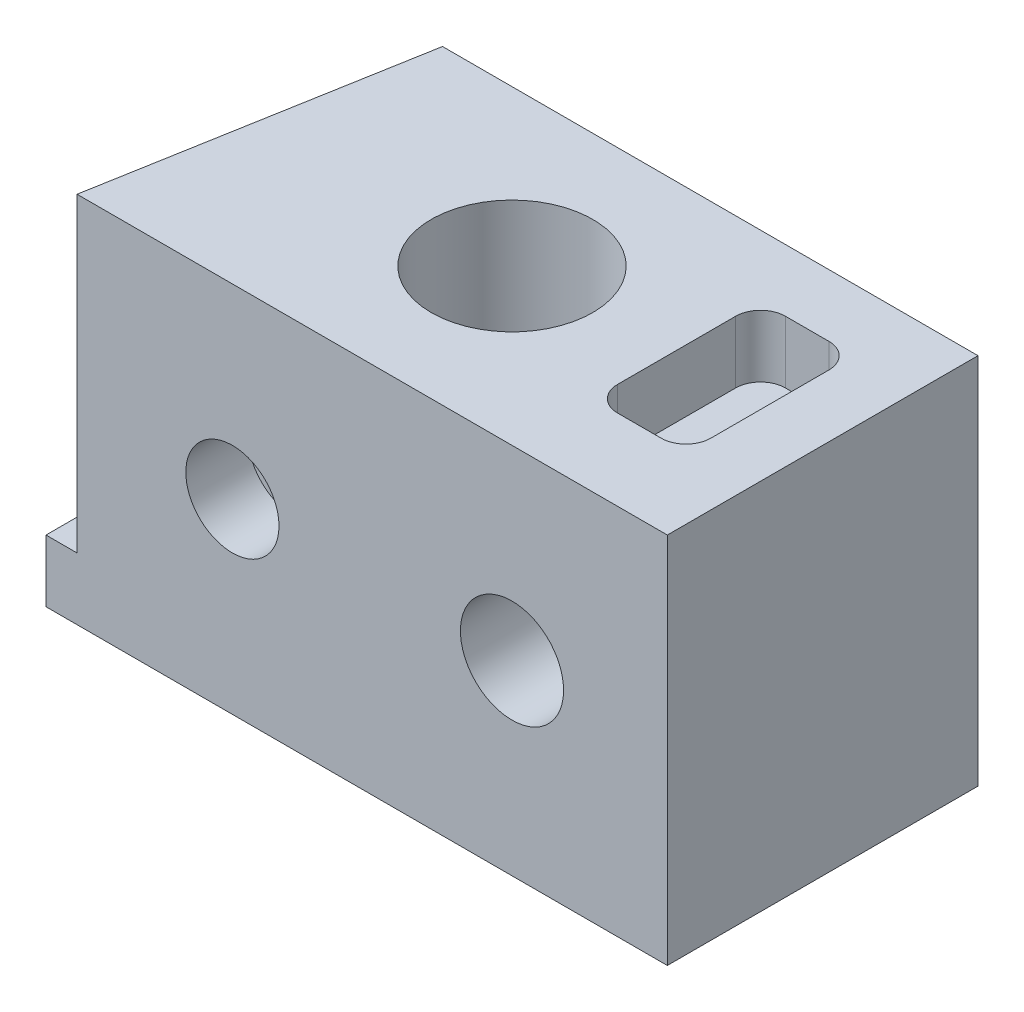
ISO-10303-21;
HEADER;
FILE_DESCRIPTION(('STEP AP214'),'2;1');
FILE_NAME('part.step','',(''),(''),'','','');
FILE_SCHEMA(('AUTOMOTIVE_DESIGN { 1 0 10303 214 1 1 1 1 }'));
ENDSEC;
DATA;
#1=APPLICATION_CONTEXT('core data for automotive mechanical design processes');
#2=APPLICATION_PROTOCOL_DEFINITION('international standard','automotive_design',2000,#1);
#3=PRODUCT_CONTEXT('',#1,'mechanical');
#4=PRODUCT('Part','Part','',(#3));
#5=PRODUCT_RELATED_PRODUCT_CATEGORY('part','',(#4));
#6=PRODUCT_DEFINITION_FORMATION('','',#4);
#7=PRODUCT_DEFINITION_CONTEXT('part definition',#1,'design');
#8=PRODUCT_DEFINITION('design','',#6,#7);
#9=PRODUCT_DEFINITION_SHAPE('','',#8);
#10=(LENGTH_UNIT() NAMED_UNIT(*) SI_UNIT(.MILLI.,.METRE.));
#11=(NAMED_UNIT(*) PLANE_ANGLE_UNIT() SI_UNIT($,.RADIAN.));
#12=(NAMED_UNIT(*) SI_UNIT($,.STERADIAN.) SOLID_ANGLE_UNIT());
#13=UNCERTAINTY_MEASURE_WITH_UNIT(LENGTH_MEASURE(1.E-05),#10,'distance_accuracy_value','');
#14=(GEOMETRIC_REPRESENTATION_CONTEXT(3) GLOBAL_UNCERTAINTY_ASSIGNED_CONTEXT((#13)) GLOBAL_UNIT_ASSIGNED_CONTEXT((#10,
#11,#12)) REPRESENTATION_CONTEXT('',''));
#15=CARTESIAN_POINT('',(0.,0.,0.));
#16=DIRECTION('',(0.,0.,1.));
#17=DIRECTION('',(1.,0.,0.));
#18=AXIS2_PLACEMENT_3D('',#15,#16,#17);
#19=CARTESIAN_POINT('',(-50.,60.,25.));
#20=DIRECTION('',(1.,0.,0.));
#21=DIRECTION('',(0.,0.,-1.));
#22=AXIS2_PLACEMENT_3D('',#19,#20,#21);
#23=PLANE('',#22);
#24=DIRECTION('',(0.,0.,1.));
#25=VECTOR('',#24,1.);
#26=CARTESIAN_POINT('',(-50.,9.99999999999999,-25.));
#27=LINE('',#26,#25);
#28=CARTESIAN_POINT('',(-50.,9.99999999999999,-25.));
#29=VERTEX_POINT('',#28);
#30=CARTESIAN_POINT('',(-50.,9.99999999999999,25.));
#31=VERTEX_POINT('',#30);
#32=EDGE_CURVE('E338',#29,#31,#27,.T.);
#33=ORIENTED_EDGE('',*,*,#32,.F.);
#34=DIRECTION('',(0.,-1.,0.));
#35=VECTOR('',#34,1.);
#36=CARTESIAN_POINT('',(-50.,60.,-25.));
#37=LINE('',#36,#35);
#38=CARTESIAN_POINT('',(-50.,0.,-25.));
#39=VERTEX_POINT('',#38);
#40=EDGE_CURVE('E54',#29,#39,#37,.T.);
#41=ORIENTED_EDGE('',*,*,#40,.T.);
#42=DIRECTION('',(0.,0.,1.));
#43=VECTOR('',#42,1.);
#44=CARTESIAN_POINT('',(-50.,0.,25.));
#45=LINE('',#44,#43);
#46=CARTESIAN_POINT('',(-50.,0.,25.));
#47=VERTEX_POINT('',#46);
#48=EDGE_CURVE('E372',#39,#47,#45,.T.);
#49=ORIENTED_EDGE('',*,*,#48,.T.);
#50=DIRECTION('',(0.,-1.,0.));
#51=VECTOR('',#50,1.);
#52=CARTESIAN_POINT('',(-50.,60.,25.));
#53=LINE('',#52,#51);
#54=EDGE_CURVE('E314',#31,#47,#53,.T.);
#55=ORIENTED_EDGE('',*,*,#54,.F.);
#56=EDGE_LOOP('',(#33,#41,#49,#55));
#57=FACE_BOUND('',#56,.T.);
#58=ADVANCED_FACE('F45',(#57),#23,.F.);
#59=CARTESIAN_POINT('',(50.,60.,25.));
#60=DIRECTION('',(-1.,0.,0.));
#61=DIRECTION('',(0.,0.,1.));
#62=AXIS2_PLACEMENT_3D('',#59,#60,#61);
#63=PLANE('',#62);
#64=DIRECTION('',(0.,0.,-1.));
#65=VECTOR('',#64,1.);
#66=CARTESIAN_POINT('',(50.,0.,25.));
#67=LINE('',#66,#65);
#68=CARTESIAN_POINT('',(50.,0.,25.));
#69=VERTEX_POINT('',#68);
#70=CARTESIAN_POINT('',(50.,0.,-25.));
#71=VERTEX_POINT('',#70);
#72=EDGE_CURVE('E365',#69,#71,#67,.T.);
#73=ORIENTED_EDGE('',*,*,#72,.T.);
#74=DIRECTION('',(0.,-1.,0.));
#75=VECTOR('',#74,1.);
#76=CARTESIAN_POINT('',(50.,60.,-25.));
#77=LINE('',#76,#75);
#78=CARTESIAN_POINT('',(50.,60.,-25.));
#79=VERTEX_POINT('',#78);
#80=EDGE_CURVE('E12',#79,#71,#77,.T.);
#81=ORIENTED_EDGE('',*,*,#80,.F.);
#82=DIRECTION('',(0.,0.,-1.));
#83=VECTOR('',#82,1.);
#84=CARTESIAN_POINT('',(50.,60.,25.));
#85=LINE('',#84,#83);
#86=CARTESIAN_POINT('',(50.,60.,25.));
#87=VERTEX_POINT('',#86);
#88=EDGE_CURVE('E346',#87,#79,#85,.T.);
#89=ORIENTED_EDGE('',*,*,#88,.F.);
#90=DIRECTION('',(0.,-1.,0.));
#91=VECTOR('',#90,1.);
#92=CARTESIAN_POINT('',(50.,60.,25.));
#93=LINE('',#92,#91);
#94=EDGE_CURVE('E317',#87,#69,#93,.T.);
#95=ORIENTED_EDGE('',*,*,#94,.T.);
#96=EDGE_LOOP('',(#73,#81,#89,#95));
#97=FACE_BOUND('',#96,.T.);
#98=ADVANCED_FACE('F47',(#97),#63,.F.);
#99=CARTESIAN_POINT('',(-50.,60.,-25.));
#100=DIRECTION('',(0.,0.,1.));
#101=DIRECTION('',(1.,0.,0.));
#102=AXIS2_PLACEMENT_3D('',#99,#100,#101);
#103=PLANE('',#102);
#104=CARTESIAN_POINT('',(25.,30.,-25.));
#105=DIRECTION('',(0.,0.,1.));
#106=DIRECTION('',(1.,0.,0.));
#107=AXIS2_PLACEMENT_3D('',#104,#105,#106);
#108=CIRCLE('',#107,8.30196488030517);
#109=CARTESIAN_POINT('',(33.3019648803052,30.,-25.));
#110=VERTEX_POINT('',#109);
#111=EDGE_CURVE('E328',#110,#110,#108,.T.);
#112=ORIENTED_EDGE('',*,*,#111,.T.);
#113=EDGE_LOOP('',(#112));
#114=FACE_BOUND('',#113,.T.);
#115=DIRECTION('',(-1.,0.,0.));
#116=VECTOR('',#115,1.);
#117=CARTESIAN_POINT('',(-50.,9.99999999999999,-25.));
#118=LINE('',#117,#116);
#119=CARTESIAN_POINT('',(-36.1836509645766,9.99999999999999,-25.));
#120=VERTEX_POINT('',#119);
#121=EDGE_CURVE('E403',#120,#29,#118,.T.);
#122=ORIENTED_EDGE('',*,*,#121,.F.);
#123=DIRECTION('',(0.,1.,0.));
#124=VECTOR('',#123,1.);
#125=CARTESIAN_POINT('',(-36.1836509645766,9.99999999999999,-25.));
#126=LINE('',#125,#124);
#127=CARTESIAN_POINT('',(-36.1836509645766,60.,-25.));
#128=VERTEX_POINT('',#127);
#129=EDGE_CURVE('E369',#120,#128,#126,.T.);
#130=ORIENTED_EDGE('',*,*,#129,.T.);
#131=DIRECTION('',(-1.,0.,0.));
#132=VECTOR('',#131,1.);
#133=CARTESIAN_POINT('',(-50.,60.,-25.));
#134=LINE('',#133,#132);
#135=EDGE_CURVE('E351',#79,#128,#134,.T.);
#136=ORIENTED_EDGE('',*,*,#135,.F.);
#137=ORIENTED_EDGE('',*,*,#80,.T.);
#138=DIRECTION('',(-1.,0.,0.));
#139=VECTOR('',#138,1.);
#140=CARTESIAN_POINT('',(-50.,0.,-25.));
#141=LINE('',#140,#139);
#142=EDGE_CURVE('E368',#71,#39,#141,.T.);
#143=ORIENTED_EDGE('',*,*,#142,.T.);
#144=ORIENTED_EDGE('',*,*,#40,.F.);
#145=EDGE_LOOP('',(#122,#130,#136,#137,#143,#144));
#146=FACE_BOUND('',#145,.T.);
#147=ADVANCED_FACE('F394',(#114,#146),#103,.F.);
#148=CARTESIAN_POINT('',(-50.,60.,25.));
#149=DIRECTION('',(0.,0.,-1.));
#150=DIRECTION('',(-1.,0.,0.));
#151=AXIS2_PLACEMENT_3D('',#148,#149,#150);
#152=PLANE('',#151);
#153=CARTESIAN_POINT('',(-20.,30.,25.));
#154=DIRECTION('',(0.,0.,1.));
#155=DIRECTION('',(1.,0.,0.));
#156=AXIS2_PLACEMENT_3D('',#153,#154,#155);
#157=CIRCLE('',#156,7.5);
#158=CARTESIAN_POINT('',(-12.5,30.,25.));
#159=VERTEX_POINT('',#158);
#160=EDGE_CURVE('E176',#159,#159,#157,.T.);
#161=ORIENTED_EDGE('',*,*,#160,.F.);
#162=EDGE_LOOP('',(#161));
#163=FACE_BOUND('',#162,.T.);
#164=CARTESIAN_POINT('',(25.,30.,25.));
#165=DIRECTION('',(0.,0.,1.));
#166=DIRECTION('',(1.,0.,0.));
#167=AXIS2_PLACEMENT_3D('',#164,#165,#166);
#168=CIRCLE('',#167,8.30196488030517);
#169=CARTESIAN_POINT('',(33.3019648803052,30.,25.));
#170=VERTEX_POINT('',#169);
#171=EDGE_CURVE('E247',#170,#170,#168,.T.);
#172=ORIENTED_EDGE('',*,*,#171,.F.);
#173=EDGE_LOOP('',(#172));
#174=FACE_BOUND('',#173,.T.);
#175=DIRECTION('',(1.,0.,0.));
#176=VECTOR('',#175,1.);
#177=CARTESIAN_POINT('',(-50.,60.,25.));
#178=LINE('',#177,#176);
#179=CARTESIAN_POINT('',(-45.,60.,25.));
#180=VERTEX_POINT('',#179);
#181=EDGE_CURVE('E361',#180,#87,#178,.T.);
#182=ORIENTED_EDGE('',*,*,#181,.F.);
#183=DIRECTION('',(0.,1.,0.));
#184=VECTOR('',#183,1.);
#185=CARTESIAN_POINT('',(-45.,9.99999999999999,25.));
#186=LINE('',#185,#184);
#187=CARTESIAN_POINT('',(-45.,9.99999999999999,25.));
#188=VERTEX_POINT('',#187);
#189=EDGE_CURVE('E69',#188,#180,#186,.T.);
#190=ORIENTED_EDGE('',*,*,#189,.F.);
#191=DIRECTION('',(1.,0.,0.));
#192=VECTOR('',#191,1.);
#193=CARTESIAN_POINT('',(-50.,9.99999999999999,25.));
#194=LINE('',#193,#192);
#195=EDGE_CURVE('E401',#31,#188,#194,.T.);
#196=ORIENTED_EDGE('',*,*,#195,.F.);
#197=ORIENTED_EDGE('',*,*,#54,.T.);
#198=DIRECTION('',(1.,0.,0.));
#199=VECTOR('',#198,1.);
#200=CARTESIAN_POINT('',(-50.,0.,25.));
#201=LINE('',#200,#199);
#202=EDGE_CURVE('E352',#47,#69,#201,.T.);
#203=ORIENTED_EDGE('',*,*,#202,.T.);
#204=ORIENTED_EDGE('',*,*,#94,.F.);
#205=EDGE_LOOP('',(#182,#190,#196,#197,#203,#204));
#206=FACE_BOUND('',#205,.T.);
#207=ADVANCED_FACE('F381',(#163,#174,#206),#152,.F.);
#208=CARTESIAN_POINT('',(0.,60.,0.));
#209=DIRECTION('',(0.,-1.,0.));
#210=DIRECTION('',(0.,0.,-1.));
#211=AXIS2_PLACEMENT_3D('',#208,#209,#210);
#212=PLANE('',#211);
#213=DIRECTION('',(1.,0.,0.));
#214=VECTOR('',#213,1.);
#215=CARTESIAN_POINT('',(29.,60.,12.));
#216=LINE('',#215,#214);
#217=CARTESIAN_POINT('',(29.,60.,12.));
#218=VERTEX_POINT('',#217);
#219=CARTESIAN_POINT('',(36.,60.,12.));
#220=VERTEX_POINT('',#219);
#221=EDGE_CURVE('E212',#218,#220,#216,.T.);
#222=ORIENTED_EDGE('',*,*,#221,.F.);
#223=CARTESIAN_POINT('',(29.,60.,8.));
#224=DIRECTION('',(0.,1.,0.));
#225=DIRECTION('',(0.,0.,1.));
#226=AXIS2_PLACEMENT_3D('',#223,#224,#225);
#227=CIRCLE('',#226,4.);
#228=CARTESIAN_POINT('',(25.,60.,8.));
#229=VERTEX_POINT('',#228);
#230=EDGE_CURVE('E61',#229,#218,#227,.T.);
#231=ORIENTED_EDGE('',*,*,#230,.F.);
#232=DIRECTION('',(0.,0.,1.));
#233=VECTOR('',#232,1.);
#234=CARTESIAN_POINT('',(25.,60.,-11.));
#235=LINE('',#234,#233);
#236=CARTESIAN_POINT('',(25.,60.,-11.));
#237=VERTEX_POINT('',#236);
#238=EDGE_CURVE('E169',#237,#229,#235,.T.);
#239=ORIENTED_EDGE('',*,*,#238,.F.);
#240=CARTESIAN_POINT('',(29.,60.,-11.));
#241=DIRECTION('',(0.,1.,0.));
#242=DIRECTION('',(0.,0.,1.));
#243=AXIS2_PLACEMENT_3D('',#240,#241,#242);
#244=CIRCLE('',#243,4.);
#245=CARTESIAN_POINT('',(29.,60.,-15.));
#246=VERTEX_POINT('',#245);
#247=EDGE_CURVE('E172',#246,#237,#244,.T.);
#248=ORIENTED_EDGE('',*,*,#247,.F.);
#249=DIRECTION('',(-1.,0.,0.));
#250=VECTOR('',#249,1.);
#251=CARTESIAN_POINT('',(29.,60.,-15.));
#252=LINE('',#251,#250);
#253=CARTESIAN_POINT('',(36.,60.,-15.));
#254=VERTEX_POINT('',#253);
#255=EDGE_CURVE('E236',#254,#246,#252,.T.);
#256=ORIENTED_EDGE('',*,*,#255,.F.);
#257=CARTESIAN_POINT('',(36.,60.,-11.));
#258=DIRECTION('',(0.,1.,0.));
#259=DIRECTION('',(0.,0.,1.));
#260=AXIS2_PLACEMENT_3D('',#257,#258,#259);
#261=CIRCLE('',#260,4.);
#262=CARTESIAN_POINT('',(40.,60.,-11.));
#263=VERTEX_POINT('',#262);
#264=EDGE_CURVE('E232',#263,#254,#261,.T.);
#265=ORIENTED_EDGE('',*,*,#264,.F.);
#266=DIRECTION('',(0.,0.,-1.));
#267=VECTOR('',#266,1.);
#268=CARTESIAN_POINT('',(40.,60.,-11.));
#269=LINE('',#268,#267);
#270=CARTESIAN_POINT('',(40.,60.,8.));
#271=VERTEX_POINT('',#270);
#272=EDGE_CURVE('E228',#271,#263,#269,.T.);
#273=ORIENTED_EDGE('',*,*,#272,.F.);
#274=CARTESIAN_POINT('',(36.,60.,8.));
#275=DIRECTION('',(0.,1.,0.));
#276=DIRECTION('',(0.,0.,1.));
#277=AXIS2_PLACEMENT_3D('',#274,#275,#276);
#278=CIRCLE('',#277,4.);
#279=EDGE_CURVE('E225',#220,#271,#278,.T.);
#280=ORIENTED_EDGE('',*,*,#279,.F.);
#281=EDGE_LOOP('',(#222,#231,#239,#248,#256,#265,#273,#280));
#282=FACE_BOUND('',#281,.T.);
#283=CARTESIAN_POINT('',(0.,60.,0.));
#284=DIRECTION('',(0.,1.,0.));
#285=DIRECTION('',(0.,0.,1.));
#286=AXIS2_PLACEMENT_3D('',#283,#284,#285);
#287=CIRCLE('',#286,13.);
#288=CARTESIAN_POINT('',(0.,60.,13.));
#289=VERTEX_POINT('',#288);
#290=EDGE_CURVE('E334',#289,#289,#287,.T.);
#291=ORIENTED_EDGE('',*,*,#290,.F.);
#292=EDGE_LOOP('',(#291));
#293=FACE_BOUND('',#292,.T.);
#294=ORIENTED_EDGE('',*,*,#135,.T.);
#295=DIRECTION('',(0.173648177666934,0.,-0.984807753012207));
#296=VECTOR('',#295,1.);
#297=CARTESIAN_POINT('',(-36.1836509645766,60.,-25.));
#298=LINE('',#297,#296);
#299=EDGE_CURVE('E333',#180,#128,#298,.T.);
#300=ORIENTED_EDGE('',*,*,#299,.F.);
#301=ORIENTED_EDGE('',*,*,#181,.T.);
#302=ORIENTED_EDGE('',*,*,#88,.T.);
#303=EDGE_LOOP('',(#294,#300,#301,#302));
#304=FACE_BOUND('',#303,.T.);
#305=ADVANCED_FACE('F399',(#282,#293,#304),#212,.F.);
#306=CARTESIAN_POINT('',(0.,0.,0.));
#307=DIRECTION('',(0.,-1.,0.));
#308=DIRECTION('',(0.,0.,-1.));
#309=AXIS2_PLACEMENT_3D('',#306,#307,#308);
#310=PLANE('',#309);
#311=ORIENTED_EDGE('',*,*,#72,.F.);
#312=ORIENTED_EDGE('',*,*,#202,.F.);
#313=ORIENTED_EDGE('',*,*,#48,.F.);
#314=ORIENTED_EDGE('',*,*,#142,.F.);
#315=EDGE_LOOP('',(#311,#312,#313,#314));
#316=FACE_BOUND('',#315,.T.);
#317=ADVANCED_FACE('F390',(#316),#310,.T.);
#318=CARTESIAN_POINT('',(-36.1836509645766,9.99999999999999,-25.));
#319=DIRECTION('',(0.984807753012207,0.,0.173648177666934));
#320=DIRECTION('',(0.173648177666934,0.,-0.984807753012208));
#321=AXIS2_PLACEMENT_3D('',#318,#319,#320);
#322=PLANE('',#321);
#323=ORIENTED_EDGE('',*,*,#299,.T.);
#324=ORIENTED_EDGE('',*,*,#129,.F.);
#325=DIRECTION('',(0.173648177666934,0.,-0.984807753012207));
#326=VECTOR('',#325,1.);
#327=CARTESIAN_POINT('',(-36.1836509645766,9.99999999999999,-25.));
#328=LINE('',#327,#326);
#329=EDGE_CURVE('E407',#188,#120,#328,.T.);
#330=ORIENTED_EDGE('',*,*,#329,.F.);
#331=ORIENTED_EDGE('',*,*,#189,.T.);
#332=EDGE_LOOP('',(#323,#324,#330,#331));
#333=FACE_BOUND('',#332,.T.);
#334=ADVANCED_FACE('F463',(#333),#322,.F.);
#335=CARTESIAN_POINT('',(0.,9.99999999999999,0.));
#336=DIRECTION('',(0.,1.,0.));
#337=DIRECTION('',(0.,0.,1.));
#338=AXIS2_PLACEMENT_3D('',#335,#336,#337);
#339=PLANE('',#338);
#340=ORIENTED_EDGE('',*,*,#32,.T.);
#341=ORIENTED_EDGE('',*,*,#195,.T.);
#342=ORIENTED_EDGE('',*,*,#329,.T.);
#343=ORIENTED_EDGE('',*,*,#121,.T.);
#344=EDGE_LOOP('',(#340,#341,#342,#343));
#345=FACE_BOUND('',#344,.T.);
#346=ADVANCED_FACE('F464',(#345),#339,.T.);
#347=CARTESIAN_POINT('',(0.,9.99999999999999,0.));
#348=DIRECTION('',(0.,1.,0.));
#349=DIRECTION('',(0.,0.,1.));
#350=AXIS2_PLACEMENT_3D('',#347,#348,#349);
#351=CYLINDRICAL_SURFACE('',#350,13.);
#352=CARTESIAN_POINT('',(0.,9.99999999999999,0.));
#353=DIRECTION('',(0.,1.,0.));
#354=DIRECTION('',(0.,0.,1.));
#355=AXIS2_PLACEMENT_3D('',#352,#353,#354);
#356=CIRCLE('',#355,13.);
#357=CARTESIAN_POINT('',(0.,9.99999999999999,13.));
#358=VERTEX_POINT('',#357);
#359=EDGE_CURVE('E330',#358,#358,#356,.T.);
#360=ORIENTED_EDGE('',*,*,#359,.F.);
#361=EDGE_LOOP('',(#360));
#362=FACE_BOUND('',#361,.T.);
#363=ORIENTED_EDGE('',*,*,#290,.T.);
#364=EDGE_LOOP('',(#363));
#365=FACE_BOUND('',#364,.T.);
#366=ADVANCED_FACE('F495',(#362,#365),#351,.F.);
#367=CARTESIAN_POINT('',(0.,9.99999999999999,0.));
#368=DIRECTION('',(0.,1.,0.));
#369=DIRECTION('',(0.,0.,1.));
#370=AXIS2_PLACEMENT_3D('',#367,#368,#369);
#371=PLANE('',#370);
#372=ORIENTED_EDGE('',*,*,#359,.T.);
#373=EDGE_LOOP('',(#372));
#374=FACE_BOUND('',#373,.T.);
#375=ADVANCED_FACE('F485',(#374),#371,.T.);
#376=CARTESIAN_POINT('',(25.,30.,-25.));
#377=DIRECTION('',(0.,0.,1.));
#378=DIRECTION('',(1.,0.,0.));
#379=AXIS2_PLACEMENT_3D('',#376,#377,#378);
#380=CYLINDRICAL_SURFACE('',#379,8.30196488030517);
#381=ORIENTED_EDGE('',*,*,#111,.F.);
#382=EDGE_LOOP('',(#381));
#383=FACE_BOUND('',#382,.T.);
#384=ORIENTED_EDGE('',*,*,#171,.T.);
#385=EDGE_LOOP('',(#384));
#386=FACE_BOUND('',#385,.T.);
#387=ADVANCED_FACE('F482',(#383,#386),#380,.F.);
#388=CARTESIAN_POINT('',(29.,50.,8.));
#389=DIRECTION('',(0.,1.,0.));
#390=DIRECTION('',(0.,0.,1.));
#391=AXIS2_PLACEMENT_3D('',#388,#389,#390);
#392=CYLINDRICAL_SURFACE('',#391,4.);
#393=ORIENTED_EDGE('',*,*,#230,.T.);
#394=DIRECTION('',(0.,1.,0.));
#395=VECTOR('',#394,1.);
#396=CARTESIAN_POINT('',(29.,50.,12.));
#397=LINE('',#396,#395);
#398=CARTESIAN_POINT('',(29.,50.,12.));
#399=VERTEX_POINT('',#398);
#400=EDGE_CURVE('E146',#399,#218,#397,.T.);
#401=ORIENTED_EDGE('',*,*,#400,.F.);
#402=CARTESIAN_POINT('',(29.,50.,8.));
#403=DIRECTION('',(0.,1.,0.));
#404=DIRECTION('',(0.,0.,1.));
#405=AXIS2_PLACEMENT_3D('',#402,#403,#404);
#406=CIRCLE('',#405,4.);
#407=CARTESIAN_POINT('',(25.,50.,8.));
#408=VERTEX_POINT('',#407);
#409=EDGE_CURVE('E150',#408,#399,#406,.T.);
#410=ORIENTED_EDGE('',*,*,#409,.F.);
#411=DIRECTION('',(0.,1.,0.));
#412=VECTOR('',#411,1.);
#413=CARTESIAN_POINT('',(25.,50.,8.));
#414=LINE('',#413,#412);
#415=EDGE_CURVE('E244',#408,#229,#414,.T.);
#416=ORIENTED_EDGE('',*,*,#415,.T.);
#417=EDGE_LOOP('',(#393,#401,#410,#416));
#418=FACE_BOUND('',#417,.T.);
#419=ADVANCED_FACE('F148',(#418),#392,.F.);
#420=CARTESIAN_POINT('',(25.,50.,-11.));
#421=DIRECTION('',(-1.,0.,0.));
#422=DIRECTION('',(0.,0.,1.));
#423=AXIS2_PLACEMENT_3D('',#420,#421,#422);
#424=PLANE('',#423);
#425=ORIENTED_EDGE('',*,*,#238,.T.);
#426=ORIENTED_EDGE('',*,*,#415,.F.);
#427=DIRECTION('',(0.,0.,1.));
#428=VECTOR('',#427,1.);
#429=CARTESIAN_POINT('',(25.,50.,-11.));
#430=LINE('',#429,#428);
#431=CARTESIAN_POINT('',(25.,50.,-11.));
#432=VERTEX_POINT('',#431);
#433=EDGE_CURVE('E156',#432,#408,#430,.T.);
#434=ORIENTED_EDGE('',*,*,#433,.F.);
#435=DIRECTION('',(0.,1.,0.));
#436=VECTOR('',#435,1.);
#437=CARTESIAN_POINT('',(25.,50.,-11.));
#438=LINE('',#437,#436);
#439=EDGE_CURVE('E248',#432,#237,#438,.T.);
#440=ORIENTED_EDGE('',*,*,#439,.T.);
#441=EDGE_LOOP('',(#425,#426,#434,#440));
#442=FACE_BOUND('',#441,.T.);
#443=ADVANCED_FACE('F493',(#442),#424,.F.);
#444=CARTESIAN_POINT('',(29.,50.,-11.));
#445=DIRECTION('',(0.,1.,0.));
#446=DIRECTION('',(0.,0.,1.));
#447=AXIS2_PLACEMENT_3D('',#444,#445,#446);
#448=CYLINDRICAL_SURFACE('',#447,4.);
#449=ORIENTED_EDGE('',*,*,#247,.T.);
#450=ORIENTED_EDGE('',*,*,#439,.F.);
#451=CARTESIAN_POINT('',(29.,50.,-11.));
#452=DIRECTION('',(0.,1.,0.));
#453=DIRECTION('',(0.,0.,1.));
#454=AXIS2_PLACEMENT_3D('',#451,#452,#453);
#455=CIRCLE('',#454,4.);
#456=CARTESIAN_POINT('',(29.,50.,-15.));
#457=VERTEX_POINT('',#456);
#458=EDGE_CURVE('E206',#457,#432,#455,.T.);
#459=ORIENTED_EDGE('',*,*,#458,.F.);
#460=DIRECTION('',(0.,1.,0.));
#461=VECTOR('',#460,1.);
#462=CARTESIAN_POINT('',(29.,50.,-15.));
#463=LINE('',#462,#461);
#464=EDGE_CURVE('E730',#457,#246,#463,.T.);
#465=ORIENTED_EDGE('',*,*,#464,.T.);
#466=EDGE_LOOP('',(#449,#450,#459,#465));
#467=FACE_BOUND('',#466,.T.);
#468=ADVANCED_FACE('F567',(#467),#448,.F.);
#469=CARTESIAN_POINT('',(29.,50.,-15.));
#470=DIRECTION('',(0.,0.,-1.));
#471=DIRECTION('',(-1.,0.,0.));
#472=AXIS2_PLACEMENT_3D('',#469,#470,#471);
#473=PLANE('',#472);
#474=ORIENTED_EDGE('',*,*,#255,.T.);
#475=ORIENTED_EDGE('',*,*,#464,.F.);
#476=DIRECTION('',(-1.,0.,0.));
#477=VECTOR('',#476,1.);
#478=CARTESIAN_POINT('',(29.,50.,-15.));
#479=LINE('',#478,#477);
#480=CARTESIAN_POINT('',(36.,50.,-15.));
#481=VERTEX_POINT('',#480);
#482=EDGE_CURVE('E198',#481,#457,#479,.T.);
#483=ORIENTED_EDGE('',*,*,#482,.F.);
#484=DIRECTION('',(0.,1.,0.));
#485=VECTOR('',#484,1.);
#486=CARTESIAN_POINT('',(36.,50.,-15.));
#487=LINE('',#486,#485);
#488=EDGE_CURVE('E727',#481,#254,#487,.T.);
#489=ORIENTED_EDGE('',*,*,#488,.T.);
#490=EDGE_LOOP('',(#474,#475,#483,#489));
#491=FACE_BOUND('',#490,.T.);
#492=ADVANCED_FACE('F572',(#491),#473,.F.);
#493=CARTESIAN_POINT('',(36.,50.,-11.));
#494=DIRECTION('',(0.,1.,0.));
#495=DIRECTION('',(0.,0.,1.));
#496=AXIS2_PLACEMENT_3D('',#493,#494,#495);
#497=CYLINDRICAL_SURFACE('',#496,4.);
#498=ORIENTED_EDGE('',*,*,#264,.T.);
#499=ORIENTED_EDGE('',*,*,#488,.F.);
#500=CARTESIAN_POINT('',(36.,50.,-11.));
#501=DIRECTION('',(0.,1.,0.));
#502=DIRECTION('',(0.,0.,1.));
#503=AXIS2_PLACEMENT_3D('',#500,#501,#502);
#504=CIRCLE('',#503,4.);
#505=CARTESIAN_POINT('',(40.,50.,-11.));
#506=VERTEX_POINT('',#505);
#507=EDGE_CURVE('E194',#506,#481,#504,.T.);
#508=ORIENTED_EDGE('',*,*,#507,.F.);
#509=DIRECTION('',(0.,1.,0.));
#510=VECTOR('',#509,1.);
#511=CARTESIAN_POINT('',(40.,50.,-11.));
#512=LINE('',#511,#510);
#513=EDGE_CURVE('E719',#506,#263,#512,.T.);
#514=ORIENTED_EDGE('',*,*,#513,.T.);
#515=EDGE_LOOP('',(#498,#499,#508,#514));
#516=FACE_BOUND('',#515,.T.);
#517=ADVANCED_FACE('F582',(#516),#497,.F.);
#518=CARTESIAN_POINT('',(40.,50.,-11.));
#519=DIRECTION('',(1.,0.,0.));
#520=DIRECTION('',(0.,0.,-1.));
#521=AXIS2_PLACEMENT_3D('',#518,#519,#520);
#522=PLANE('',#521);
#523=ORIENTED_EDGE('',*,*,#272,.T.);
#524=ORIENTED_EDGE('',*,*,#513,.F.);
#525=DIRECTION('',(0.,0.,-1.));
#526=VECTOR('',#525,1.);
#527=CARTESIAN_POINT('',(40.,50.,-11.));
#528=LINE('',#527,#526);
#529=CARTESIAN_POINT('',(40.,50.,8.));
#530=VERTEX_POINT('',#529);
#531=EDGE_CURVE('E190',#530,#506,#528,.T.);
#532=ORIENTED_EDGE('',*,*,#531,.F.);
#533=DIRECTION('',(0.,1.,0.));
#534=VECTOR('',#533,1.);
#535=CARTESIAN_POINT('',(40.,50.,8.));
#536=LINE('',#535,#534);
#537=EDGE_CURVE('E721',#530,#271,#536,.T.);
#538=ORIENTED_EDGE('',*,*,#537,.T.);
#539=EDGE_LOOP('',(#523,#524,#532,#538));
#540=FACE_BOUND('',#539,.T.);
#541=ADVANCED_FACE('F587',(#540),#522,.F.);
#542=CARTESIAN_POINT('',(36.,50.,8.));
#543=DIRECTION('',(0.,1.,0.));
#544=DIRECTION('',(0.,0.,1.));
#545=AXIS2_PLACEMENT_3D('',#542,#543,#544);
#546=CYLINDRICAL_SURFACE('',#545,4.);
#547=ORIENTED_EDGE('',*,*,#279,.T.);
#548=ORIENTED_EDGE('',*,*,#537,.F.);
#549=CARTESIAN_POINT('',(36.,50.,8.));
#550=DIRECTION('',(0.,1.,0.));
#551=DIRECTION('',(0.,0.,1.));
#552=AXIS2_PLACEMENT_3D('',#549,#550,#551);
#553=CIRCLE('',#552,4.);
#554=CARTESIAN_POINT('',(36.,50.,12.));
#555=VERTEX_POINT('',#554);
#556=EDGE_CURVE('E164',#555,#530,#553,.T.);
#557=ORIENTED_EDGE('',*,*,#556,.F.);
#558=DIRECTION('',(0.,1.,0.));
#559=VECTOR('',#558,1.);
#560=CARTESIAN_POINT('',(36.,50.,12.));
#561=LINE('',#560,#559);
#562=EDGE_CURVE('E155',#555,#220,#561,.T.);
#563=ORIENTED_EDGE('',*,*,#562,.T.);
#564=EDGE_LOOP('',(#547,#548,#557,#563));
#565=FACE_BOUND('',#564,.T.);
#566=ADVANCED_FACE('F601',(#565),#546,.F.);
#567=CARTESIAN_POINT('',(29.,50.,12.));
#568=DIRECTION('',(0.,0.,1.));
#569=DIRECTION('',(1.,0.,0.));
#570=AXIS2_PLACEMENT_3D('',#567,#568,#569);
#571=PLANE('',#570);
#572=ORIENTED_EDGE('',*,*,#221,.T.);
#573=ORIENTED_EDGE('',*,*,#562,.F.);
#574=DIRECTION('',(1.,0.,0.));
#575=VECTOR('',#574,1.);
#576=CARTESIAN_POINT('',(29.,50.,12.));
#577=LINE('',#576,#575);
#578=EDGE_CURVE('E159',#399,#555,#577,.T.);
#579=ORIENTED_EDGE('',*,*,#578,.F.);
#580=ORIENTED_EDGE('',*,*,#400,.T.);
#581=EDGE_LOOP('',(#572,#573,#579,#580));
#582=FACE_BOUND('',#581,.T.);
#583=ADVANCED_FACE('F160',(#582),#571,.F.);
#584=CARTESIAN_POINT('',(29.,50.,8.));
#585=DIRECTION('',(0.,1.,0.));
#586=DIRECTION('',(0.,0.,1.));
#587=AXIS2_PLACEMENT_3D('',#584,#585,#586);
#588=PLANE('',#587);
#589=ORIENTED_EDGE('',*,*,#409,.T.);
#590=ORIENTED_EDGE('',*,*,#578,.T.);
#591=ORIENTED_EDGE('',*,*,#556,.T.);
#592=ORIENTED_EDGE('',*,*,#531,.T.);
#593=ORIENTED_EDGE('',*,*,#507,.T.);
#594=ORIENTED_EDGE('',*,*,#482,.T.);
#595=ORIENTED_EDGE('',*,*,#458,.T.);
#596=ORIENTED_EDGE('',*,*,#433,.T.);
#597=EDGE_LOOP('',(#589,#590,#591,#592,#593,#594,#595,#596));
#598=FACE_BOUND('',#597,.T.);
#599=ADVANCED_FACE('F166',(#598),#588,.T.);
#600=CARTESIAN_POINT('',(-20.,30.,15.));
#601=DIRECTION('',(0.,0.,1.));
#602=DIRECTION('',(1.,0.,0.));
#603=AXIS2_PLACEMENT_3D('',#600,#601,#602);
#604=CYLINDRICAL_SURFACE('',#603,7.5);
#605=CARTESIAN_POINT('',(-20.,30.,15.));
#606=DIRECTION('',(0.,0.,1.));
#607=DIRECTION('',(1.,0.,0.));
#608=AXIS2_PLACEMENT_3D('',#605,#606,#607);
#609=CIRCLE('',#608,7.5);
#610=CARTESIAN_POINT('',(-12.5,30.,15.));
#611=VERTEX_POINT('',#610);
#612=EDGE_CURVE('E213',#611,#611,#609,.T.);
#613=ORIENTED_EDGE('',*,*,#612,.F.);
#614=EDGE_LOOP('',(#613));
#615=FACE_BOUND('',#614,.T.);
#616=ORIENTED_EDGE('',*,*,#160,.T.);
#617=EDGE_LOOP('',(#616));
#618=FACE_BOUND('',#617,.T.);
#619=ADVANCED_FACE('F545',(#615,#618),#604,.F.);
#620=CARTESIAN_POINT('',(-20.,30.,15.));
#621=DIRECTION('',(0.,0.,1.));
#622=DIRECTION('',(1.,0.,0.));
#623=AXIS2_PLACEMENT_3D('',#620,#621,#622);
#624=PLANE('',#623);
#625=ORIENTED_EDGE('',*,*,#612,.T.);
#626=EDGE_LOOP('',(#625));
#627=FACE_BOUND('',#626,.T.);
#628=ADVANCED_FACE('F548',(#627),#624,.T.);
#629=CLOSED_SHELL('',(#58,#98,#147,#207,#305,#317,#334,#346,#366,#375,#387,#419,#443,#468,#492,
#517,#541,#566,#583,#599,#619,#628));
#630=MANIFOLD_SOLID_BREP('B2',#629);
#631=ADVANCED_BREP_SHAPE_REPRESENTATION('',(#18,#630),#14);
#632=SHAPE_DEFINITION_REPRESENTATION(#9,#631);
ENDSEC;
END-ISO-10303-21;
